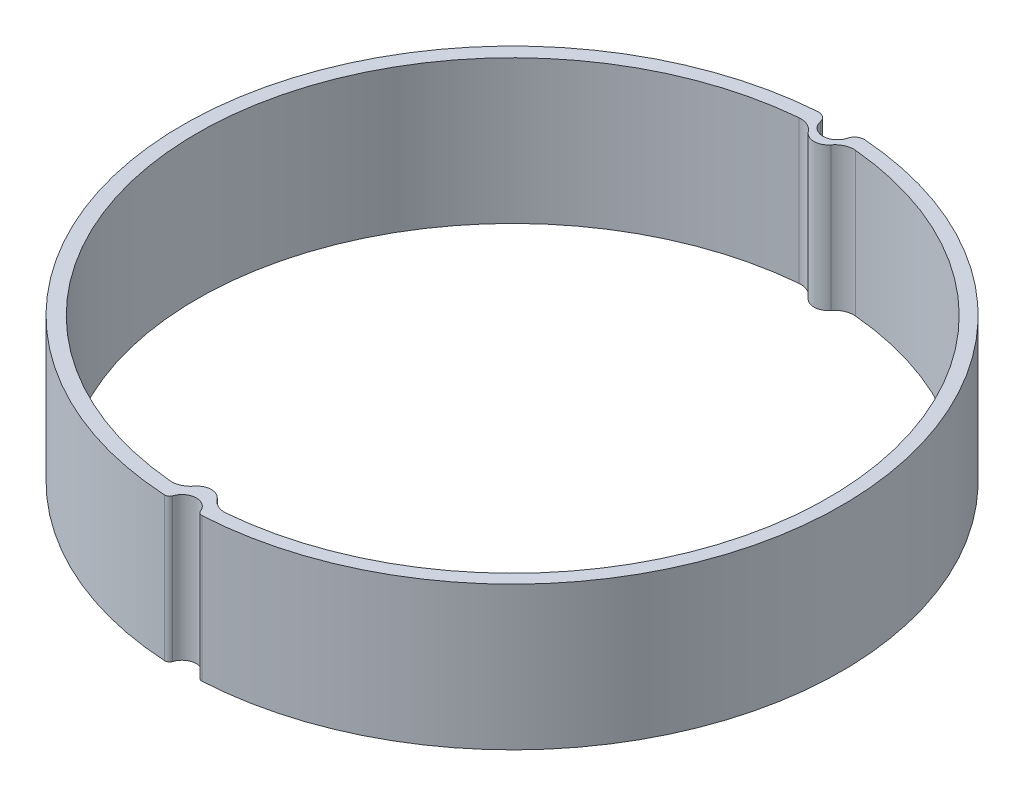
ISO-10303-21;
HEADER;
FILE_DESCRIPTION(('STEP AP214'),'2;1');
FILE_NAME('part.step','',(''),(''),'','','');
FILE_SCHEMA(('AUTOMOTIVE_DESIGN { 1 0 10303 214 1 1 1 1 }'));
ENDSEC;
DATA;
#1=APPLICATION_CONTEXT('core data for automotive mechanical design processes');
#2=APPLICATION_PROTOCOL_DEFINITION('international standard','automotive_design',2000,#1);
#3=PRODUCT_CONTEXT('',#1,'mechanical');
#4=PRODUCT('Part','Part','',(#3));
#5=PRODUCT_RELATED_PRODUCT_CATEGORY('part','',(#4));
#6=PRODUCT_DEFINITION_FORMATION('','',#4);
#7=PRODUCT_DEFINITION_CONTEXT('part definition',#1,'design');
#8=PRODUCT_DEFINITION('design','',#6,#7);
#9=PRODUCT_DEFINITION_SHAPE('','',#8);
#10=(LENGTH_UNIT() NAMED_UNIT(*) SI_UNIT(.MILLI.,.METRE.));
#11=(NAMED_UNIT(*) PLANE_ANGLE_UNIT() SI_UNIT($,.RADIAN.));
#12=(NAMED_UNIT(*) SI_UNIT($,.STERADIAN.) SOLID_ANGLE_UNIT());
#13=UNCERTAINTY_MEASURE_WITH_UNIT(LENGTH_MEASURE(1.E-05),#10,'distance_accuracy_value','');
#14=(GEOMETRIC_REPRESENTATION_CONTEXT(3) GLOBAL_UNCERTAINTY_ASSIGNED_CONTEXT((#13)) GLOBAL_UNIT_ASSIGNED_CONTEXT((#10,
#11,#12)) REPRESENTATION_CONTEXT('',''));
#15=CARTESIAN_POINT('',(0.,0.,0.));
#16=DIRECTION('',(0.,0.,1.));
#17=DIRECTION('',(1.,0.,0.));
#18=AXIS2_PLACEMENT_3D('',#15,#16,#17);
#19=CARTESIAN_POINT('',(-1.92172864096543,15.,33.9423579945423));
#20=DIRECTION('',(0.,-1.,0.));
#21=DIRECTION('',(0.,0.,-1.));
#22=AXIS2_PLACEMENT_3D('',#19,#20,#21);
#23=CYLINDRICAL_SURFACE('',#22,0.500000000000001);
#24=CARTESIAN_POINT('',(-1.92172864096543,0.,33.9423579945423));
#25=DIRECTION('',(0.,1.,0.));
#26=DIRECTION('',(0.,0.,1.));
#27=AXIS2_PLACEMENT_3D('',#24,#25,#26);
#28=CIRCLE('',#27,0.500000000000001);
#29=CARTESIAN_POINT('',(-1.4454207692633,0.,34.0944461642157));
#30=VERTEX_POINT('',#29);
#31=CARTESIAN_POINT('',(-1.94999208608717,0.,34.4415585330736));
#32=VERTEX_POINT('',#31);
#33=EDGE_CURVE('E165',#30,#32,#28,.F.);
#34=ORIENTED_EDGE('',*,*,#33,.F.);
#35=DIRECTION('',(0.,-1.,0.));
#36=VECTOR('',#35,1.);
#37=CARTESIAN_POINT('',(-1.4454207692633,15.,34.0944461642157));
#38=LINE('',#37,#36);
#39=CARTESIAN_POINT('',(-1.4454207692633,15.,34.0944461642157));
#40=VERTEX_POINT('',#39);
#41=EDGE_CURVE('E11',#40,#30,#38,.T.);
#42=ORIENTED_EDGE('',*,*,#41,.F.);
#43=CARTESIAN_POINT('',(-1.92172864096543,15.,33.9423579945423));
#44=DIRECTION('',(0.,1.,0.));
#45=DIRECTION('',(0.,0.,1.));
#46=AXIS2_PLACEMENT_3D('',#43,#44,#45);
#47=CIRCLE('',#46,0.500000000000001);
#48=CARTESIAN_POINT('',(-1.94999208608717,15.,34.4415585330736));
#49=VERTEX_POINT('',#48);
#50=EDGE_CURVE('E218',#40,#49,#47,.F.);
#51=ORIENTED_EDGE('',*,*,#50,.T.);
#52=DIRECTION('',(0.,-1.,0.));
#53=VECTOR('',#52,1.);
#54=CARTESIAN_POINT('',(-1.94999208608717,15.,34.4415585330736));
#55=LINE('',#54,#53);
#56=EDGE_CURVE('E239',#49,#32,#55,.T.);
#57=ORIENTED_EDGE('',*,*,#56,.T.);
#58=EDGE_LOOP('',(#34,#42,#51,#57));
#59=FACE_BOUND('',#58,.T.);
#60=ADVANCED_FACE('F39',(#59),#23,.T.);
#61=CARTESIAN_POINT('',(-0.0164971541568842,15.,34.5507106732357));
#62=DIRECTION('',(0.,-1.,0.));
#63=DIRECTION('',(0.,0.,-1.));
#64=AXIS2_PLACEMENT_3D('',#61,#62,#63);
#65=CYLINDRICAL_SURFACE('',#64,1.50000000000002);
#66=CARTESIAN_POINT('',(-0.0164971541568842,0.,34.5507106732357));
#67=DIRECTION('',(0.,1.,0.));
#68=DIRECTION('',(0.,0.,1.));
#69=AXIS2_PLACEMENT_3D('',#66,#67,#68);
#70=CIRCLE('',#69,1.50000000000002);
#71=CARTESIAN_POINT('',(1.38818443880293,0.,34.0245266537141));
#72=VERTEX_POINT('',#71);
#73=EDGE_CURVE('E242',#72,#30,#70,.T.);
#74=ORIENTED_EDGE('',*,*,#73,.F.);
#75=DIRECTION('',(0.,-1.,0.));
#76=VECTOR('',#75,1.);
#77=CARTESIAN_POINT('',(1.38818443880293,15.,34.0245266537141));
#78=LINE('',#77,#76);
#79=CARTESIAN_POINT('',(1.38818443880293,15.,34.0245266537141));
#80=VERTEX_POINT('',#79);
#81=EDGE_CURVE('E46',#80,#72,#78,.T.);
#82=ORIENTED_EDGE('',*,*,#81,.F.);
#83=CARTESIAN_POINT('',(-0.0164971541568842,15.,34.5507106732357));
#84=DIRECTION('',(0.,1.,0.));
#85=DIRECTION('',(0.,0.,1.));
#86=AXIS2_PLACEMENT_3D('',#83,#84,#85);
#87=CIRCLE('',#86,1.50000000000002);
#88=EDGE_CURVE('E221',#80,#40,#87,.T.);
#89=ORIENTED_EDGE('',*,*,#88,.T.);
#90=ORIENTED_EDGE('',*,*,#41,.T.);
#91=EDGE_LOOP('',(#74,#82,#89,#90));
#92=FACE_BOUND('',#91,.T.);
#93=ADVANCED_FACE('F283',(#92),#65,.F.);
#94=CARTESIAN_POINT('',(1.8564116364562,15.,33.8491319805402));
#95=DIRECTION('',(0.,-1.,0.));
#96=DIRECTION('',(0.,0.,-1.));
#97=AXIS2_PLACEMENT_3D('',#94,#95,#96);
#98=CYLINDRICAL_SURFACE('',#97,0.500000000000003);
#99=CARTESIAN_POINT('',(1.8564116364562,0.,33.8491319805402));
#100=DIRECTION('',(0.,1.,0.));
#101=DIRECTION('',(0.,0.,1.));
#102=AXIS2_PLACEMENT_3D('',#99,#100,#101);
#103=CIRCLE('',#102,0.500000000000003);
#104=CARTESIAN_POINT('',(1.8837923390588,0.,34.3483817147665));
#105=VERTEX_POINT('',#104);
#106=EDGE_CURVE('E245',#72,#105,#103,.T.);
#107=ORIENTED_EDGE('',*,*,#106,.T.);
#108=DIRECTION('',(0.,-1.,0.));
#109=VECTOR('',#108,1.);
#110=CARTESIAN_POINT('',(1.8837923390588,15.,34.3483817147665));
#111=LINE('',#110,#109);
#112=CARTESIAN_POINT('',(1.8837923390588,15.,34.3483817147665));
#113=VERTEX_POINT('',#112);
#114=EDGE_CURVE('E270',#113,#105,#111,.T.);
#115=ORIENTED_EDGE('',*,*,#114,.F.);
#116=CARTESIAN_POINT('',(1.8564116364562,15.,33.8491319805402));
#117=DIRECTION('',(0.,1.,0.));
#118=DIRECTION('',(0.,0.,1.));
#119=AXIS2_PLACEMENT_3D('',#116,#117,#118);
#120=CIRCLE('',#119,0.500000000000003);
#121=EDGE_CURVE('E225',#80,#113,#120,.T.);
#122=ORIENTED_EDGE('',*,*,#121,.F.);
#123=ORIENTED_EDGE('',*,*,#81,.T.);
#124=EDGE_LOOP('',(#107,#115,#122,#123));
#125=FACE_BOUND('',#124,.T.);
#126=ADVANCED_FACE('F275',(#125),#98,.T.);
#127=CARTESIAN_POINT('',(0.,15.,0.));
#128=DIRECTION('',(0.,-1.,0.));
#129=DIRECTION('',(0.,0.,-1.));
#130=AXIS2_PLACEMENT_3D('',#127,#128,#129);
#131=CYLINDRICAL_SURFACE('',#130,34.4);
#132=CARTESIAN_POINT('',(0.,0.,0.));
#133=DIRECTION('',(0.,1.,0.));
#134=DIRECTION('',(0.,0.,1.));
#135=AXIS2_PLACEMENT_3D('',#132,#133,#134);
#136=CIRCLE('',#135,34.4);
#137=CARTESIAN_POINT('',(2.49310498878496,0.,-34.3095384334283));
#138=VERTEX_POINT('',#137);
#139=EDGE_CURVE('E247',#105,#138,#136,.T.);
#140=ORIENTED_EDGE('',*,*,#139,.T.);
#141=DIRECTION('',(0.,-1.,0.));
#142=VECTOR('',#141,1.);
#143=CARTESIAN_POINT('',(2.49310498878496,15.,-34.3095384334283));
#144=LINE('',#143,#142);
#145=CARTESIAN_POINT('',(2.49310498878496,15.,-34.3095384334283));
#146=VERTEX_POINT('',#145);
#147=EDGE_CURVE('E268',#146,#138,#144,.T.);
#148=ORIENTED_EDGE('',*,*,#147,.F.);
#149=CARTESIAN_POINT('',(0.,15.,0.));
#150=DIRECTION('',(0.,1.,0.));
#151=DIRECTION('',(0.,0.,1.));
#152=AXIS2_PLACEMENT_3D('',#149,#150,#151);
#153=CIRCLE('',#152,34.4);
#154=EDGE_CURVE('E227',#113,#146,#153,.T.);
#155=ORIENTED_EDGE('',*,*,#154,.F.);
#156=ORIENTED_EDGE('',*,*,#114,.T.);
#157=EDGE_LOOP('',(#140,#148,#155,#156));
#158=FACE_BOUND('',#157,.T.);
#159=ADVANCED_FACE('F308',(#158),#131,.T.);
#160=CARTESIAN_POINT('',(2.42063100655284,15.,-33.312168130131));
#161=DIRECTION('',(0.,-1.,0.));
#162=DIRECTION('',(0.,0.,-1.));
#163=AXIS2_PLACEMENT_3D('',#160,#161,#162);
#164=CYLINDRICAL_SURFACE('',#163,1.);
#165=CARTESIAN_POINT('',(2.42063100655284,0.,-33.312168130131));
#166=DIRECTION('',(0.,1.,0.));
#167=DIRECTION('',(0.,0.,1.));
#168=AXIS2_PLACEMENT_3D('',#165,#166,#167);
#169=CIRCLE('',#168,1.);
#170=CARTESIAN_POINT('',(1.45237860393167,0.,-33.5621426984741));
#171=VERTEX_POINT('',#170);
#172=EDGE_CURVE('E250',#171,#138,#169,.F.);
#173=ORIENTED_EDGE('',*,*,#172,.F.);
#174=DIRECTION('',(0.,-1.,0.));
#175=VECTOR('',#174,1.);
#176=CARTESIAN_POINT('',(1.45237860393167,15.,-33.5621426984741));
#177=LINE('',#176,#175);
#178=CARTESIAN_POINT('',(1.45237860393167,15.,-33.5621426984741));
#179=VERTEX_POINT('',#178);
#180=EDGE_CURVE('E266',#179,#171,#177,.T.);
#181=ORIENTED_EDGE('',*,*,#180,.F.);
#182=CARTESIAN_POINT('',(2.42063100655284,15.,-33.312168130131));
#183=DIRECTION('',(0.,1.,0.));
#184=DIRECTION('',(0.,0.,1.));
#185=AXIS2_PLACEMENT_3D('',#182,#183,#184);
#186=CIRCLE('',#185,1.);
#187=EDGE_CURVE('E229',#179,#146,#186,.F.);
#188=ORIENTED_EDGE('',*,*,#187,.T.);
#189=ORIENTED_EDGE('',*,*,#147,.T.);
#190=EDGE_LOOP('',(#173,#181,#188,#189));
#191=FACE_BOUND('',#190,.T.);
#192=ADVANCED_FACE('F303',(#191),#164,.T.);
#193=CARTESIAN_POINT('',(0.,15.,-33.9371045509888));
#194=DIRECTION('',(0.,-1.,0.));
#195=DIRECTION('',(0.,0.,-1.));
#196=AXIS2_PLACEMENT_3D('',#193,#194,#195);
#197=CYLINDRICAL_SURFACE('',#196,1.49999999999991);
#198=CARTESIAN_POINT('',(0.,0.,-33.9371045509888));
#199=DIRECTION('',(0.,1.,0.));
#200=DIRECTION('',(0.,0.,1.));
#201=AXIS2_PLACEMENT_3D('',#198,#199,#200);
#202=CIRCLE('',#201,1.49999999999991);
#203=CARTESIAN_POINT('',(-1.4659548304889,0.,-33.6193366561882));
#204=VERTEX_POINT('',#203);
#205=EDGE_CURVE('E253',#204,#171,#202,.T.);
#206=ORIENTED_EDGE('',*,*,#205,.F.);
#207=DIRECTION('',(0.,-1.,0.));
#208=VECTOR('',#207,1.);
#209=CARTESIAN_POINT('',(-1.4659548304889,15.,-33.6193366561882));
#210=LINE('',#209,#208);
#211=CARTESIAN_POINT('',(-1.4659548304889,15.,-33.6193366561882));
#212=VERTEX_POINT('',#211);
#213=EDGE_CURVE('E264',#212,#204,#210,.T.);
#214=ORIENTED_EDGE('',*,*,#213,.F.);
#215=CARTESIAN_POINT('',(0.,15.,-33.9371045509888));
#216=DIRECTION('',(0.,1.,0.));
#217=DIRECTION('',(0.,0.,1.));
#218=AXIS2_PLACEMENT_3D('',#215,#216,#217);
#219=CIRCLE('',#218,1.49999999999991);
#220=EDGE_CURVE('E232',#212,#179,#219,.T.);
#221=ORIENTED_EDGE('',*,*,#220,.T.);
#222=ORIENTED_EDGE('',*,*,#180,.T.);
#223=EDGE_LOOP('',(#206,#214,#221,#222));
#224=FACE_BOUND('',#223,.T.);
#225=ADVANCED_FACE('F300',(#224),#197,.F.);
#226=CARTESIAN_POINT('',(-2.44325805081488,15.,-33.4074913929878));
#227=DIRECTION('',(0.,-1.,0.));
#228=DIRECTION('',(0.,0.,-1.));
#229=AXIS2_PLACEMENT_3D('',#226,#227,#228);
#230=CYLINDRICAL_SURFACE('',#229,1.);
#231=CARTESIAN_POINT('',(-2.44325805081488,0.,-33.4074913929878));
#232=DIRECTION('',(0.,1.,0.));
#233=DIRECTION('',(0.,0.,1.));
#234=AXIS2_PLACEMENT_3D('',#231,#232,#233);
#235=CIRCLE('',#234,1.);
#236=CARTESIAN_POINT('',(-2.51619827700864,0.,-34.4048277070779));
#237=VERTEX_POINT('',#236);
#238=EDGE_CURVE('E256',#204,#237,#235,.T.);
#239=ORIENTED_EDGE('',*,*,#238,.T.);
#240=DIRECTION('',(0.,-1.,0.));
#241=VECTOR('',#240,1.);
#242=CARTESIAN_POINT('',(-2.51619827700864,15.,-34.4048277070779));
#243=LINE('',#242,#241);
#244=CARTESIAN_POINT('',(-2.51619827700864,15.,-34.4048277070779));
#245=VERTEX_POINT('',#244);
#246=EDGE_CURVE('E261',#245,#237,#243,.T.);
#247=ORIENTED_EDGE('',*,*,#246,.F.);
#248=CARTESIAN_POINT('',(-2.44325805081488,15.,-33.4074913929878));
#249=DIRECTION('',(0.,1.,0.));
#250=DIRECTION('',(0.,0.,1.));
#251=AXIS2_PLACEMENT_3D('',#248,#249,#250);
#252=CIRCLE('',#251,1.);
#253=EDGE_CURVE('E235',#212,#245,#252,.T.);
#254=ORIENTED_EDGE('',*,*,#253,.F.);
#255=ORIENTED_EDGE('',*,*,#213,.T.);
#256=EDGE_LOOP('',(#239,#247,#254,#255));
#257=FACE_BOUND('',#256,.T.);
#258=ADVANCED_FACE('F297',(#257),#230,.T.);
#259=CARTESIAN_POINT('',(0.,15.,0.));
#260=DIRECTION('',(0.,-1.,0.));
#261=DIRECTION('',(0.,0.,-1.));
#262=AXIS2_PLACEMENT_3D('',#259,#260,#261);
#263=CYLINDRICAL_SURFACE('',#262,34.496716123755);
#264=CARTESIAN_POINT('',(0.,0.,0.));
#265=DIRECTION('',(0.,1.,0.));
#266=DIRECTION('',(0.,0.,1.));
#267=AXIS2_PLACEMENT_3D('',#264,#265,#266);
#268=CIRCLE('',#267,34.496716123755);
#269=EDGE_CURVE('E222',#237,#32,#268,.T.);
#270=ORIENTED_EDGE('',*,*,#269,.T.);
#271=ORIENTED_EDGE('',*,*,#56,.F.);
#272=CARTESIAN_POINT('',(0.,15.,0.));
#273=DIRECTION('',(0.,1.,0.));
#274=DIRECTION('',(0.,0.,1.));
#275=AXIS2_PLACEMENT_3D('',#272,#273,#274);
#276=CIRCLE('',#275,34.496716123755);
#277=EDGE_CURVE('E237',#245,#49,#276,.T.);
#278=ORIENTED_EDGE('',*,*,#277,.F.);
#279=ORIENTED_EDGE('',*,*,#246,.T.);
#280=EDGE_LOOP('',(#270,#271,#278,#279));
#281=FACE_BOUND('',#280,.T.);
#282=ADVANCED_FACE('F292',(#281),#263,.T.);
#283=CARTESIAN_POINT('',(0.,15.,0.));
#284=DIRECTION('',(0.,1.,0.));
#285=DIRECTION('',(0.,0.,1.));
#286=AXIS2_PLACEMENT_3D('',#283,#284,#285);
#287=PLANE('',#286);
#288=CARTESIAN_POINT('',(-2.78107443266088,15.,30.875));
#289=DIRECTION('',(0.,1.,0.));
#290=DIRECTION('',(0.,0.,-1.));
#291=AXIS2_PLACEMENT_3D('',#288,#289,#290);
#292=CIRCLE('',#291,2.);
#293=CARTESIAN_POINT('',(-2.96049858960675,15.,32.866935483871));
#294=VERTEX_POINT('',#293);
#295=CARTESIAN_POINT('',(-1.19188904256895,15.,32.0892857142857));
#296=VERTEX_POINT('',#295);
#297=EDGE_CURVE('E156',#294,#296,#292,.T.);
#298=ORIENTED_EDGE('',*,*,#297,.F.);
#299=CARTESIAN_POINT('',(0.,15.,0.));
#300=DIRECTION('',(0.,1.,0.));
#301=DIRECTION('',(0.,0.,1.));
#302=AXIS2_PLACEMENT_3D('',#299,#300,#301);
#303=CIRCLE('',#302,33.);
#304=CARTESIAN_POINT('',(-2.96049858960674,15.,-32.866935483871));
#305=VERTEX_POINT('',#304);
#306=EDGE_CURVE('E148',#305,#294,#303,.T.);
#307=ORIENTED_EDGE('',*,*,#306,.F.);
#308=CARTESIAN_POINT('',(-2.78107443266088,15.,-30.875));
#309=DIRECTION('',(0.,1.,0.));
#310=DIRECTION('',(0.,0.,1.));
#311=AXIS2_PLACEMENT_3D('',#308,#309,#310);
#312=CIRCLE('',#311,2.);
#313=CARTESIAN_POINT('',(-1.19188904256895,15.,-32.0892857142857));
#314=VERTEX_POINT('',#313);
#315=EDGE_CURVE('E184',#314,#305,#312,.T.);
#316=ORIENTED_EDGE('',*,*,#315,.F.);
#317=CARTESIAN_POINT('',(0.,15.,-33.));
#318=DIRECTION('',(0.,-1.,0.));
#319=DIRECTION('',(0.,0.,1.));
#320=AXIS2_PLACEMENT_3D('',#317,#318,#319);
#321=CIRCLE('',#320,1.5);
#322=CARTESIAN_POINT('',(1.19188904256895,15.,-32.0892857142857));
#323=VERTEX_POINT('',#322);
#324=EDGE_CURVE('E182',#323,#314,#321,.T.);
#325=ORIENTED_EDGE('',*,*,#324,.F.);
#326=CARTESIAN_POINT('',(2.78107443266088,15.,-30.875));
#327=DIRECTION('',(0.,1.,0.));
#328=DIRECTION('',(0.,0.,-1.));
#329=AXIS2_PLACEMENT_3D('',#326,#327,#328);
#330=CIRCLE('',#329,2.);
#331=CARTESIAN_POINT('',(2.96049858960673,15.,-32.866935483871));
#332=VERTEX_POINT('',#331);
#333=EDGE_CURVE('E180',#332,#323,#330,.T.);
#334=ORIENTED_EDGE('',*,*,#333,.F.);
#335=CARTESIAN_POINT('',(0.,15.,0.));
#336=DIRECTION('',(0.,1.,0.));
#337=DIRECTION('',(0.,0.,1.));
#338=AXIS2_PLACEMENT_3D('',#335,#336,#337);
#339=CIRCLE('',#338,33.);
#340=CARTESIAN_POINT('',(2.96049858960674,15.,32.866935483871));
#341=VERTEX_POINT('',#340);
#342=EDGE_CURVE('E178',#341,#332,#339,.T.);
#343=ORIENTED_EDGE('',*,*,#342,.F.);
#344=CARTESIAN_POINT('',(2.78107443266088,15.,30.875));
#345=DIRECTION('',(0.,1.,0.));
#346=DIRECTION('',(0.,0.,1.));
#347=AXIS2_PLACEMENT_3D('',#344,#345,#346);
#348=CIRCLE('',#347,2.);
#349=CARTESIAN_POINT('',(1.19188904256895,15.,32.0892857142857));
#350=VERTEX_POINT('',#349);
#351=EDGE_CURVE('E174',#350,#341,#348,.T.);
#352=ORIENTED_EDGE('',*,*,#351,.F.);
#353=CARTESIAN_POINT('',(0.,15.,33.));
#354=DIRECTION('',(0.,-1.,0.));
#355=DIRECTION('',(0.,0.,1.));
#356=AXIS2_PLACEMENT_3D('',#353,#354,#355);
#357=CIRCLE('',#356,1.5);
#358=EDGE_CURVE('E172',#296,#350,#357,.T.);
#359=ORIENTED_EDGE('',*,*,#358,.F.);
#360=EDGE_LOOP('',(#298,#307,#316,#325,#334,#343,#352,#359));
#361=FACE_BOUND('',#360,.T.);
#362=ORIENTED_EDGE('',*,*,#50,.F.);
#363=ORIENTED_EDGE('',*,*,#88,.F.);
#364=ORIENTED_EDGE('',*,*,#121,.T.);
#365=ORIENTED_EDGE('',*,*,#154,.T.);
#366=ORIENTED_EDGE('',*,*,#187,.F.);
#367=ORIENTED_EDGE('',*,*,#220,.F.);
#368=ORIENTED_EDGE('',*,*,#253,.T.);
#369=ORIENTED_EDGE('',*,*,#277,.T.);
#370=EDGE_LOOP('',(#362,#363,#364,#365,#366,#367,#368,#369));
#371=FACE_BOUND('',#370,.T.);
#372=ADVANCED_FACE('F169',(#361,#371),#287,.T.);
#373=CARTESIAN_POINT('',(0.,0.,0.));
#374=DIRECTION('',(0.,1.,0.));
#375=DIRECTION('',(0.,0.,1.));
#376=AXIS2_PLACEMENT_3D('',#373,#374,#375);
#377=PLANE('',#376);
#378=CARTESIAN_POINT('',(0.,0.,0.));
#379=DIRECTION('',(0.,1.,0.));
#380=DIRECTION('',(0.,0.,1.));
#381=AXIS2_PLACEMENT_3D('',#378,#379,#380);
#382=CIRCLE('',#381,33.);
#383=CARTESIAN_POINT('',(-2.96049858960674,0.,-32.866935483871));
#384=VERTEX_POINT('',#383);
#385=CARTESIAN_POINT('',(-2.96049858960675,0.,32.866935483871));
#386=VERTEX_POINT('',#385);
#387=EDGE_CURVE('E186',#384,#386,#382,.T.);
#388=ORIENTED_EDGE('',*,*,#387,.T.);
#389=CARTESIAN_POINT('',(-2.78107443266088,0.,30.875));
#390=DIRECTION('',(0.,1.,0.));
#391=DIRECTION('',(0.,0.,-1.));
#392=AXIS2_PLACEMENT_3D('',#389,#390,#391);
#393=CIRCLE('',#392,2.);
#394=CARTESIAN_POINT('',(-1.19188904256895,0.,32.0892857142857));
#395=VERTEX_POINT('',#394);
#396=EDGE_CURVE('E163',#386,#395,#393,.T.);
#397=ORIENTED_EDGE('',*,*,#396,.T.);
#398=CARTESIAN_POINT('',(0.,0.,33.));
#399=DIRECTION('',(0.,-1.,0.));
#400=DIRECTION('',(0.,0.,1.));
#401=AXIS2_PLACEMENT_3D('',#398,#399,#400);
#402=CIRCLE('',#401,1.5);
#403=CARTESIAN_POINT('',(1.19188904256895,0.,32.0892857142857));
#404=VERTEX_POINT('',#403);
#405=EDGE_CURVE('E189',#395,#404,#402,.T.);
#406=ORIENTED_EDGE('',*,*,#405,.T.);
#407=CARTESIAN_POINT('',(2.78107443266088,0.,30.875));
#408=DIRECTION('',(0.,1.,0.));
#409=DIRECTION('',(0.,0.,1.));
#410=AXIS2_PLACEMENT_3D('',#407,#408,#409);
#411=CIRCLE('',#410,2.);
#412=CARTESIAN_POINT('',(2.96049858960674,0.,32.866935483871));
#413=VERTEX_POINT('',#412);
#414=EDGE_CURVE('E192',#404,#413,#411,.T.);
#415=ORIENTED_EDGE('',*,*,#414,.T.);
#416=CARTESIAN_POINT('',(0.,0.,0.));
#417=DIRECTION('',(0.,1.,0.));
#418=DIRECTION('',(0.,0.,1.));
#419=AXIS2_PLACEMENT_3D('',#416,#417,#418);
#420=CIRCLE('',#419,33.);
#421=CARTESIAN_POINT('',(2.96049858960673,0.,-32.866935483871));
#422=VERTEX_POINT('',#421);
#423=EDGE_CURVE('E195',#413,#422,#420,.T.);
#424=ORIENTED_EDGE('',*,*,#423,.T.);
#425=CARTESIAN_POINT('',(2.78107443266088,0.,-30.875));
#426=DIRECTION('',(0.,1.,0.));
#427=DIRECTION('',(0.,0.,-1.));
#428=AXIS2_PLACEMENT_3D('',#425,#426,#427);
#429=CIRCLE('',#428,2.);
#430=CARTESIAN_POINT('',(1.19188904256895,0.,-32.0892857142857));
#431=VERTEX_POINT('',#430);
#432=EDGE_CURVE('E198',#422,#431,#429,.T.);
#433=ORIENTED_EDGE('',*,*,#432,.T.);
#434=CARTESIAN_POINT('',(0.,0.,-33.));
#435=DIRECTION('',(0.,-1.,0.));
#436=DIRECTION('',(0.,0.,1.));
#437=AXIS2_PLACEMENT_3D('',#434,#435,#436);
#438=CIRCLE('',#437,1.5);
#439=CARTESIAN_POINT('',(-1.19188904256895,0.,-32.0892857142857));
#440=VERTEX_POINT('',#439);
#441=EDGE_CURVE('E201',#431,#440,#438,.T.);
#442=ORIENTED_EDGE('',*,*,#441,.T.);
#443=CARTESIAN_POINT('',(-2.78107443266088,0.,-30.875));
#444=DIRECTION('',(0.,1.,0.));
#445=DIRECTION('',(0.,0.,1.));
#446=AXIS2_PLACEMENT_3D('',#443,#444,#445);
#447=CIRCLE('',#446,2.);
#448=EDGE_CURVE('E157',#440,#384,#447,.T.);
#449=ORIENTED_EDGE('',*,*,#448,.T.);
#450=EDGE_LOOP('',(#388,#397,#406,#415,#424,#433,#442,#449));
#451=FACE_BOUND('',#450,.T.);
#452=ORIENTED_EDGE('',*,*,#33,.T.);
#453=ORIENTED_EDGE('',*,*,#269,.F.);
#454=ORIENTED_EDGE('',*,*,#238,.F.);
#455=ORIENTED_EDGE('',*,*,#205,.T.);
#456=ORIENTED_EDGE('',*,*,#172,.T.);
#457=ORIENTED_EDGE('',*,*,#139,.F.);
#458=ORIENTED_EDGE('',*,*,#106,.F.);
#459=ORIENTED_EDGE('',*,*,#73,.T.);
#460=EDGE_LOOP('',(#452,#453,#454,#455,#456,#457,#458,#459));
#461=FACE_BOUND('',#460,.T.);
#462=ADVANCED_FACE('F282',(#451,#461),#377,.F.);
#463=CARTESIAN_POINT('',(0.,15.,0.));
#464=DIRECTION('',(0.,-1.,0.));
#465=DIRECTION('',(0.,0.,-1.));
#466=AXIS2_PLACEMENT_3D('',#463,#464,#465);
#467=CYLINDRICAL_SURFACE('',#466,33.);
#468=ORIENTED_EDGE('',*,*,#387,.F.);
#469=DIRECTION('',(0.,-1.,0.));
#470=VECTOR('',#469,1.);
#471=CARTESIAN_POINT('',(-2.96049858960674,15.,-32.866935483871));
#472=LINE('',#471,#470);
#473=EDGE_CURVE('E58',#305,#384,#472,.T.);
#474=ORIENTED_EDGE('',*,*,#473,.F.);
#475=ORIENTED_EDGE('',*,*,#306,.T.);
#476=DIRECTION('',(0.,-1.,0.));
#477=VECTOR('',#476,1.);
#478=CARTESIAN_POINT('',(-2.96049858960675,15.,32.866935483871));
#479=LINE('',#478,#477);
#480=EDGE_CURVE('E151',#294,#386,#479,.T.);
#481=ORIENTED_EDGE('',*,*,#480,.T.);
#482=EDGE_LOOP('',(#468,#474,#475,#481));
#483=FACE_BOUND('',#482,.T.);
#484=ADVANCED_FACE('F150',(#483),#467,.F.);
#485=CARTESIAN_POINT('',(-2.78107443266088,15.,30.875));
#486=DIRECTION('',(0.,-1.,0.));
#487=DIRECTION('',(0.,0.,-1.));
#488=AXIS2_PLACEMENT_3D('',#485,#486,#487);
#489=CYLINDRICAL_SURFACE('',#488,2.);
#490=ORIENTED_EDGE('',*,*,#396,.F.);
#491=ORIENTED_EDGE('',*,*,#480,.F.);
#492=ORIENTED_EDGE('',*,*,#297,.T.);
#493=DIRECTION('',(0.,-1.,0.));
#494=VECTOR('',#493,1.);
#495=CARTESIAN_POINT('',(-1.19188904256895,15.,32.0892857142857));
#496=LINE('',#495,#494);
#497=EDGE_CURVE('E166',#296,#395,#496,.T.);
#498=ORIENTED_EDGE('',*,*,#497,.T.);
#499=EDGE_LOOP('',(#490,#491,#492,#498));
#500=FACE_BOUND('',#499,.T.);
#501=ADVANCED_FACE('F160',(#500),#489,.F.);
#502=CARTESIAN_POINT('',(0.,15.,33.));
#503=DIRECTION('',(0.,-1.,0.));
#504=DIRECTION('',(0.,0.,-1.));
#505=AXIS2_PLACEMENT_3D('',#502,#503,#504);
#506=CYLINDRICAL_SURFACE('',#505,1.5);
#507=ORIENTED_EDGE('',*,*,#405,.F.);
#508=ORIENTED_EDGE('',*,*,#497,.F.);
#509=ORIENTED_EDGE('',*,*,#358,.T.);
#510=DIRECTION('',(0.,-1.,0.));
#511=VECTOR('',#510,1.);
#512=CARTESIAN_POINT('',(1.19188904256895,15.,32.0892857142857));
#513=LINE('',#512,#511);
#514=EDGE_CURVE('E215',#350,#404,#513,.T.);
#515=ORIENTED_EDGE('',*,*,#514,.T.);
#516=EDGE_LOOP('',(#507,#508,#509,#515));
#517=FACE_BOUND('',#516,.T.);
#518=ADVANCED_FACE('F371',(#517),#506,.T.);
#519=CARTESIAN_POINT('',(2.78107443266088,15.,30.875));
#520=DIRECTION('',(0.,-1.,0.));
#521=DIRECTION('',(0.,0.,-1.));
#522=AXIS2_PLACEMENT_3D('',#519,#520,#521);
#523=CYLINDRICAL_SURFACE('',#522,2.);
#524=ORIENTED_EDGE('',*,*,#414,.F.);
#525=ORIENTED_EDGE('',*,*,#514,.F.);
#526=ORIENTED_EDGE('',*,*,#351,.T.);
#527=DIRECTION('',(0.,-1.,0.));
#528=VECTOR('',#527,1.);
#529=CARTESIAN_POINT('',(2.96049858960674,15.,32.866935483871));
#530=LINE('',#529,#528);
#531=EDGE_CURVE('E212',#341,#413,#530,.T.);
#532=ORIENTED_EDGE('',*,*,#531,.T.);
#533=EDGE_LOOP('',(#524,#525,#526,#532));
#534=FACE_BOUND('',#533,.T.);
#535=ADVANCED_FACE('F380',(#534),#523,.F.);
#536=CARTESIAN_POINT('',(0.,15.,0.));
#537=DIRECTION('',(0.,-1.,0.));
#538=DIRECTION('',(0.,0.,-1.));
#539=AXIS2_PLACEMENT_3D('',#536,#537,#538);
#540=CYLINDRICAL_SURFACE('',#539,33.);
#541=ORIENTED_EDGE('',*,*,#423,.F.);
#542=ORIENTED_EDGE('',*,*,#531,.F.);
#543=ORIENTED_EDGE('',*,*,#342,.T.);
#544=DIRECTION('',(0.,-1.,0.));
#545=VECTOR('',#544,1.);
#546=CARTESIAN_POINT('',(2.96049858960673,15.,-32.866935483871));
#547=LINE('',#546,#545);
#548=EDGE_CURVE('E210',#332,#422,#547,.T.);
#549=ORIENTED_EDGE('',*,*,#548,.T.);
#550=EDGE_LOOP('',(#541,#542,#543,#549));
#551=FACE_BOUND('',#550,.T.);
#552=ADVANCED_FACE('F390',(#551),#540,.F.);
#553=CARTESIAN_POINT('',(2.78107443266088,15.,-30.875));
#554=DIRECTION('',(0.,-1.,0.));
#555=DIRECTION('',(0.,0.,-1.));
#556=AXIS2_PLACEMENT_3D('',#553,#554,#555);
#557=CYLINDRICAL_SURFACE('',#556,2.);
#558=ORIENTED_EDGE('',*,*,#432,.F.);
#559=ORIENTED_EDGE('',*,*,#548,.F.);
#560=ORIENTED_EDGE('',*,*,#333,.T.);
#561=DIRECTION('',(0.,-1.,0.));
#562=VECTOR('',#561,1.);
#563=CARTESIAN_POINT('',(1.19188904256895,15.,-32.0892857142857));
#564=LINE('',#563,#562);
#565=EDGE_CURVE('E208',#323,#431,#564,.T.);
#566=ORIENTED_EDGE('',*,*,#565,.T.);
#567=EDGE_LOOP('',(#558,#559,#560,#566));
#568=FACE_BOUND('',#567,.T.);
#569=ADVANCED_FACE('F401',(#568),#557,.F.);
#570=CARTESIAN_POINT('',(0.,15.,-33.));
#571=DIRECTION('',(0.,-1.,0.));
#572=DIRECTION('',(0.,0.,-1.));
#573=AXIS2_PLACEMENT_3D('',#570,#571,#572);
#574=CYLINDRICAL_SURFACE('',#573,1.5);
#575=ORIENTED_EDGE('',*,*,#441,.F.);
#576=ORIENTED_EDGE('',*,*,#565,.F.);
#577=ORIENTED_EDGE('',*,*,#324,.T.);
#578=DIRECTION('',(0.,-1.,0.));
#579=VECTOR('',#578,1.);
#580=CARTESIAN_POINT('',(-1.19188904256895,15.,-32.0892857142857));
#581=LINE('',#580,#579);
#582=EDGE_CURVE('E53',#314,#440,#581,.T.);
#583=ORIENTED_EDGE('',*,*,#582,.T.);
#584=EDGE_LOOP('',(#575,#576,#577,#583));
#585=FACE_BOUND('',#584,.T.);
#586=ADVANCED_FACE('F411',(#585),#574,.T.);
#587=CARTESIAN_POINT('',(-2.78107443266088,15.,-30.875));
#588=DIRECTION('',(0.,-1.,0.));
#589=DIRECTION('',(0.,0.,-1.));
#590=AXIS2_PLACEMENT_3D('',#587,#588,#589);
#591=CYLINDRICAL_SURFACE('',#590,2.);
#592=ORIENTED_EDGE('',*,*,#448,.F.);
#593=ORIENTED_EDGE('',*,*,#582,.F.);
#594=ORIENTED_EDGE('',*,*,#315,.T.);
#595=ORIENTED_EDGE('',*,*,#473,.T.);
#596=EDGE_LOOP('',(#592,#593,#594,#595));
#597=FACE_BOUND('',#596,.T.);
#598=ADVANCED_FACE('F421',(#597),#591,.F.);
#599=CLOSED_SHELL('',(#60,#93,#126,#159,#192,#225,#258,#282,#372,#462,#484,#501,#518,#535,#552,
#569,#586,#598));
#600=MANIFOLD_SOLID_BREP('B2',#599);
#601=ADVANCED_BREP_SHAPE_REPRESENTATION('',(#18,#600),#14);
#602=SHAPE_DEFINITION_REPRESENTATION(#9,#601);
ENDSEC;
END-ISO-10303-21;
